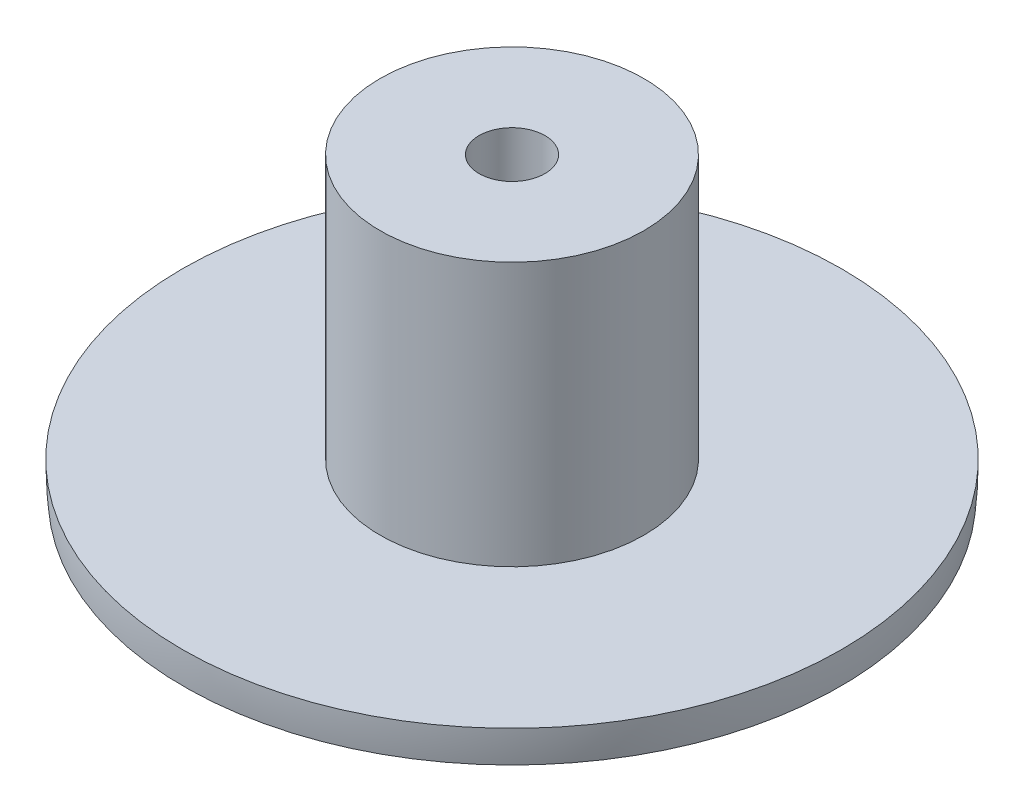
ISO-10303-21;
HEADER;
FILE_DESCRIPTION(('STEP AP214'),'2;1');
FILE_NAME('part.step','',(''),(''),'','','');
FILE_SCHEMA(('AUTOMOTIVE_DESIGN { 1 0 10303 214 1 1 1 1 }'));
ENDSEC;
DATA;
#1=APPLICATION_CONTEXT('core data for automotive mechanical design processes');
#2=APPLICATION_PROTOCOL_DEFINITION('international standard','automotive_design',2000,#1);
#3=PRODUCT_CONTEXT('',#1,'mechanical');
#4=PRODUCT('Part','Part','',(#3));
#5=PRODUCT_RELATED_PRODUCT_CATEGORY('part','',(#4));
#6=PRODUCT_DEFINITION_FORMATION('','',#4);
#7=PRODUCT_DEFINITION_CONTEXT('part definition',#1,'design');
#8=PRODUCT_DEFINITION('design','',#6,#7);
#9=PRODUCT_DEFINITION_SHAPE('','',#8);
#10=(LENGTH_UNIT() NAMED_UNIT(*) SI_UNIT(.MILLI.,.METRE.));
#11=(NAMED_UNIT(*) PLANE_ANGLE_UNIT() SI_UNIT($,.RADIAN.));
#12=(NAMED_UNIT(*) SI_UNIT($,.STERADIAN.) SOLID_ANGLE_UNIT());
#13=UNCERTAINTY_MEASURE_WITH_UNIT(LENGTH_MEASURE(1.E-05),#10,'distance_accuracy_value','');
#14=(GEOMETRIC_REPRESENTATION_CONTEXT(3) GLOBAL_UNCERTAINTY_ASSIGNED_CONTEXT((#13)) GLOBAL_UNIT_ASSIGNED_CONTEXT((#10,
#11,#12)) REPRESENTATION_CONTEXT('',''));
#15=CARTESIAN_POINT('',(0.,0.,0.));
#16=DIRECTION('',(0.,0.,1.));
#17=DIRECTION('',(1.,0.,0.));
#18=AXIS2_PLACEMENT_3D('',#15,#16,#17);
#19=CARTESIAN_POINT('',(0.,-6.35000000000001,0.));
#20=DIRECTION('',(0.,1.,0.));
#21=DIRECTION('',(-1.,0.,0.));
#22=AXIS2_PLACEMENT_3D('',#19,#20,#21);
#23=PLANE('',#22);
#24=CARTESIAN_POINT('',(0.,-6.35000000000001,0.));
#25=DIRECTION('',(0.,1.,0.));
#26=DIRECTION('',(-1.,0.,0.));
#27=AXIS2_PLACEMENT_3D('',#24,#25,#26);
#28=CIRCLE('',#27,6.35);
#29=CARTESIAN_POINT('',(-6.35,-6.35000000000001,0.));
#30=VERTEX_POINT('',#29);
#31=EDGE_CURVE('E56',#30,#30,#28,.T.);
#32=ORIENTED_EDGE('',*,*,#31,.T.);
#33=EDGE_LOOP('',(#32));
#34=FACE_BOUND('',#33,.T.);
#35=CARTESIAN_POINT('',(0.,-6.35000000000002,0.));
#36=DIRECTION('',(0.,1.,0.));
#37=DIRECTION('',(-1.,0.,0.));
#38=AXIS2_PLACEMENT_3D('',#35,#36,#37);
#39=CIRCLE('',#38,63.1817022562704);
#40=CARTESIAN_POINT('',(-63.1817022562704,-6.35000000000003,0.));
#41=VERTEX_POINT('',#40);
#42=EDGE_CURVE('E40',#41,#41,#39,.T.);
#43=ORIENTED_EDGE('',*,*,#42,.F.);
#44=EDGE_LOOP('',(#43));
#45=FACE_BOUND('',#44,.T.);
#46=ADVANCED_FACE('F37',(#34,#45),#23,.F.);
#47=CARTESIAN_POINT('',(0.,0.,0.));
#48=DIRECTION('',(0.,1.,0.));
#49=DIRECTION('',(1.,0.,0.));
#50=AXIS2_PLACEMENT_3D('',#47,#48,#49);
#51=SPHERICAL_SURFACE('',#50,63.5);
#52=CARTESIAN_POINT('',(0.,0.,0.));
#53=DIRECTION('',(0.,1.,0.));
#54=DIRECTION('',(-1.,0.,0.));
#55=AXIS2_PLACEMENT_3D('',#52,#53,#54);
#56=CIRCLE('',#55,63.5);
#57=CARTESIAN_POINT('',(-63.5,0.,0.));
#58=VERTEX_POINT('',#57);
#59=EDGE_CURVE('E48',#58,#58,#56,.T.);
#60=ORIENTED_EDGE('',*,*,#59,.F.);
#61=EDGE_LOOP('',(#60));
#62=FACE_BOUND('',#61,.T.);
#63=ORIENTED_EDGE('',*,*,#42,.T.);
#64=EDGE_LOOP('',(#63));
#65=FACE_BOUND('',#64,.T.);
#66=ADVANCED_FACE('F83',(#62,#65),#51,.T.);
#67=CARTESIAN_POINT('',(0.,0.,0.));
#68=DIRECTION('',(0.,-1.,0.));
#69=DIRECTION('',(1.,0.,0.));
#70=AXIS2_PLACEMENT_3D('',#67,#68,#69);
#71=PLANE('',#70);
#72=CARTESIAN_POINT('',(0.,0.,0.));
#73=DIRECTION('',(0.,1.,0.));
#74=DIRECTION('',(-1.,0.,0.));
#75=AXIS2_PLACEMENT_3D('',#72,#73,#74);
#76=CIRCLE('',#75,25.4);
#77=CARTESIAN_POINT('',(-25.4,0.,0.));
#78=VERTEX_POINT('',#77);
#79=EDGE_CURVE('E10',#78,#78,#76,.T.);
#80=ORIENTED_EDGE('',*,*,#79,.F.);
#81=EDGE_LOOP('',(#80));
#82=FACE_BOUND('',#81,.T.);
#83=ORIENTED_EDGE('',*,*,#59,.T.);
#84=EDGE_LOOP('',(#83));
#85=FACE_BOUND('',#84,.T.);
#86=ADVANCED_FACE('F79',(#82,#85),#71,.F.);
#87=CARTESIAN_POINT('',(0.,50.8,0.));
#88=DIRECTION('',(0.,-1.,0.));
#89=DIRECTION('',(1.,0.,0.));
#90=AXIS2_PLACEMENT_3D('',#87,#88,#89);
#91=CYLINDRICAL_SURFACE('',#90,25.4);
#92=CARTESIAN_POINT('',(0.,50.8,0.));
#93=DIRECTION('',(0.,1.,0.));
#94=DIRECTION('',(-1.,0.,0.));
#95=AXIS2_PLACEMENT_3D('',#92,#93,#94);
#96=CIRCLE('',#95,25.4);
#97=CARTESIAN_POINT('',(-25.4,50.8,0.));
#98=VERTEX_POINT('',#97);
#99=EDGE_CURVE('E50',#98,#98,#96,.T.);
#100=ORIENTED_EDGE('',*,*,#99,.F.);
#101=EDGE_LOOP('',(#100));
#102=FACE_BOUND('',#101,.T.);
#103=ORIENTED_EDGE('',*,*,#79,.T.);
#104=EDGE_LOOP('',(#103));
#105=FACE_BOUND('',#104,.T.);
#106=ADVANCED_FACE('F72',(#102,#105),#91,.T.);
#107=CARTESIAN_POINT('',(0.,50.8,0.));
#108=DIRECTION('',(0.,1.,0.));
#109=DIRECTION('',(-1.,0.,0.));
#110=AXIS2_PLACEMENT_3D('',#107,#108,#109);
#111=PLANE('',#110);
#112=CARTESIAN_POINT('',(0.,50.8,0.));
#113=DIRECTION('',(0.,1.,0.));
#114=DIRECTION('',(-1.,0.,0.));
#115=AXIS2_PLACEMENT_3D('',#112,#113,#114);
#116=CIRCLE('',#115,6.35);
#117=CARTESIAN_POINT('',(-6.35000000000001,50.8,0.));
#118=VERTEX_POINT('',#117);
#119=EDGE_CURVE('E60',#118,#118,#116,.T.);
#120=ORIENTED_EDGE('',*,*,#119,.F.);
#121=EDGE_LOOP('',(#120));
#122=FACE_BOUND('',#121,.T.);
#123=ORIENTED_EDGE('',*,*,#99,.T.);
#124=EDGE_LOOP('',(#123));
#125=FACE_BOUND('',#124,.T.);
#126=ADVANCED_FACE('F70',(#122,#125),#111,.T.);
#127=CARTESIAN_POINT('',(0.,-37.084,0.));
#128=DIRECTION('',(0.,1.,0.));
#129=DIRECTION('',(-1.,0.,0.));
#130=AXIS2_PLACEMENT_3D('',#127,#128,#129);
#131=CYLINDRICAL_SURFACE('',#130,6.35);
#132=CARTESIAN_POINT('',(-6.35000000000001,50.8,0.));
#133=CARTESIAN_POINT('',(-6.35000000000001,50.2046875,0.));
#134=CARTESIAN_POINT('',(-6.35000000000001,49.609375,0.));
#135=CARTESIAN_POINT('',(-6.35000000000001,48.41875,0.));
#136=CARTESIAN_POINT('',(-6.35000000000001,47.8234375,0.));
#137=CARTESIAN_POINT('',(-6.35000000000001,46.6328125,0.));
#138=CARTESIAN_POINT('',(-6.35000000000001,46.0375,0.));
#139=CARTESIAN_POINT('',(-6.35000000000001,44.846875,0.));
#140=CARTESIAN_POINT('',(-6.35,44.2515625,0.));
#141=CARTESIAN_POINT('',(-6.35,43.0609375,0.));
#142=CARTESIAN_POINT('',(-6.35,42.465625,0.));
#143=CARTESIAN_POINT('',(-6.35,41.275,0.));
#144=CARTESIAN_POINT('',(-6.35,40.6796875,0.));
#145=CARTESIAN_POINT('',(-6.35,39.4890625,0.));
#146=CARTESIAN_POINT('',(-6.35,38.89375,0.));
#147=CARTESIAN_POINT('',(-6.35,37.703125,0.));
#148=CARTESIAN_POINT('',(-6.35,37.1078125,0.));
#149=CARTESIAN_POINT('',(-6.35,35.9171875,0.));
#150=CARTESIAN_POINT('',(-6.35,35.321875,0.));
#151=CARTESIAN_POINT('',(-6.35,34.13125,0.));
#152=CARTESIAN_POINT('',(-6.35,33.5359375,0.));
#153=CARTESIAN_POINT('',(-6.35,32.3453125,0.));
#154=CARTESIAN_POINT('',(-6.35,31.75,0.));
#155=CARTESIAN_POINT('',(-6.35,30.559375,0.));
#156=CARTESIAN_POINT('',(-6.35,29.9640625,0.));
#157=CARTESIAN_POINT('',(-6.35,28.7734375,0.));
#158=CARTESIAN_POINT('',(-6.35,28.178125,0.));
#159=CARTESIAN_POINT('',(-6.35,26.9875,0.));
#160=CARTESIAN_POINT('',(-6.35,26.3921875,0.));
#161=CARTESIAN_POINT('',(-6.35,25.2015625,0.));
#162=CARTESIAN_POINT('',(-6.35,24.60625,0.));
#163=CARTESIAN_POINT('',(-6.35,23.415625,0.));
#164=CARTESIAN_POINT('',(-6.35,22.8203125,0.));
#165=CARTESIAN_POINT('',(-6.35,21.6296875,0.));
#166=CARTESIAN_POINT('',(-6.35,21.034375,0.));
#167=CARTESIAN_POINT('',(-6.35,19.84375,0.));
#168=CARTESIAN_POINT('',(-6.35,19.2484375,0.));
#169=CARTESIAN_POINT('',(-6.35,18.0578125,0.));
#170=CARTESIAN_POINT('',(-6.35,17.4625,0.));
#171=CARTESIAN_POINT('',(-6.35,16.271875,0.));
#172=CARTESIAN_POINT('',(-6.35,15.6765625,0.));
#173=CARTESIAN_POINT('',(-6.35,14.4859375,0.));
#174=CARTESIAN_POINT('',(-6.35,13.890625,0.));
#175=CARTESIAN_POINT('',(-6.35,12.7,0.));
#176=CARTESIAN_POINT('',(-6.35,12.1046875,0.));
#177=CARTESIAN_POINT('',(-6.35,10.9140625,0.));
#178=CARTESIAN_POINT('',(-6.35,10.31875,0.));
#179=CARTESIAN_POINT('',(-6.35,9.12812499999999,0.));
#180=CARTESIAN_POINT('',(-6.35,8.53281249999999,0.));
#181=CARTESIAN_POINT('',(-6.35,7.34218749999999,0.));
#182=CARTESIAN_POINT('',(-6.35,6.74687499999999,0.));
#183=CARTESIAN_POINT('',(-6.35,5.55624999999999,0.));
#184=CARTESIAN_POINT('',(-6.35,4.96093749999999,0.));
#185=CARTESIAN_POINT('',(-6.35,3.77031249999999,0.));
#186=CARTESIAN_POINT('',(-6.35,3.17499999999999,0.));
#187=CARTESIAN_POINT('',(-6.35,1.98437499999999,0.));
#188=CARTESIAN_POINT('',(-6.35,1.38906249999999,0.));
#189=CARTESIAN_POINT('',(-6.35,0.198437499999989,0.));
#190=CARTESIAN_POINT('',(-6.35,-0.396875000000012,0.));
#191=CARTESIAN_POINT('',(-6.35,-1.58750000000001,0.));
#192=CARTESIAN_POINT('',(-6.35,-2.18281250000001,0.));
#193=CARTESIAN_POINT('',(-6.35,-3.37343750000001,0.));
#194=CARTESIAN_POINT('',(-6.35,-3.96875000000001,0.));
#195=CARTESIAN_POINT('',(-6.35,-5.15937500000001,0.));
#196=CARTESIAN_POINT('',(-6.35,-5.75468750000001,0.));
#197=CARTESIAN_POINT('',(-6.35,-6.35000000000001,0.));
#198=B_SPLINE_CURVE_WITH_KNOTS('',3,(#132,#133,#134,#135,#136,#137,#138,#139,#140,#141,#142,
#143,#144,#145,#146,#147,#148,#149,#150,#151,#152,#153,#154,#155,#156,#157,#158,#159,#160,#161,
#162,#163,#164,#165,#166,#167,#168,#169,#170,#171,#172,#173,#174,#175,#176,#177,#178,#179,#180,
#181,#182,#183,#184,#185,#186,#187,#188,#189,#190,#191,#192,#193,#194,#195,#196,#197),
.UNSPECIFIED.,.F.,.F.,(4,2,2,2,2,2,2,2,2,2,2,2,2,2,2,2,2,2,2,2,2,2,2,2,2,2,2,2,2,2,2,2,4),(0.,
1.7859375,3.571875,5.3578125,7.14375,8.92968750000001,10.715625,12.5015625,14.2875,16.0734375,
17.859375,19.6453125,21.43125,23.2171875,25.003125,26.7890625,28.575,30.3609375,32.146875,
33.9328125,35.71875,37.5046875,39.290625,41.0765625,42.8625,44.6484375,46.434375,48.2203125,
50.00625,51.7921875,53.578125,55.3640625,57.15),.UNSPECIFIED.);
#199=EDGE_CURVE('BSEAM67',#118,#30,#198,.T.);
#200=ORIENTED_EDGE('',*,*,#119,.T.);
#201=ORIENTED_EDGE('',*,*,#31,.F.);
#202=ORIENTED_EDGE('',*,*,#199,.T.);
#203=ORIENTED_EDGE('',*,*,#199,.F.);
#204=EDGE_LOOP('',(#200,#202,#201,#203));
#205=FACE_BOUND('',#204,.T.);
#206=ADVANCED_FACE('F67',(#205),#131,.F.);
#207=CLOSED_SHELL('',(#46,#66,#86,#106,#126,#206));
#208=MANIFOLD_SOLID_BREP('B2',#207);
#209=ADVANCED_BREP_SHAPE_REPRESENTATION('',(#18,#208),#14);
#210=SHAPE_DEFINITION_REPRESENTATION(#9,#209);
ENDSEC;
END-ISO-10303-21;
